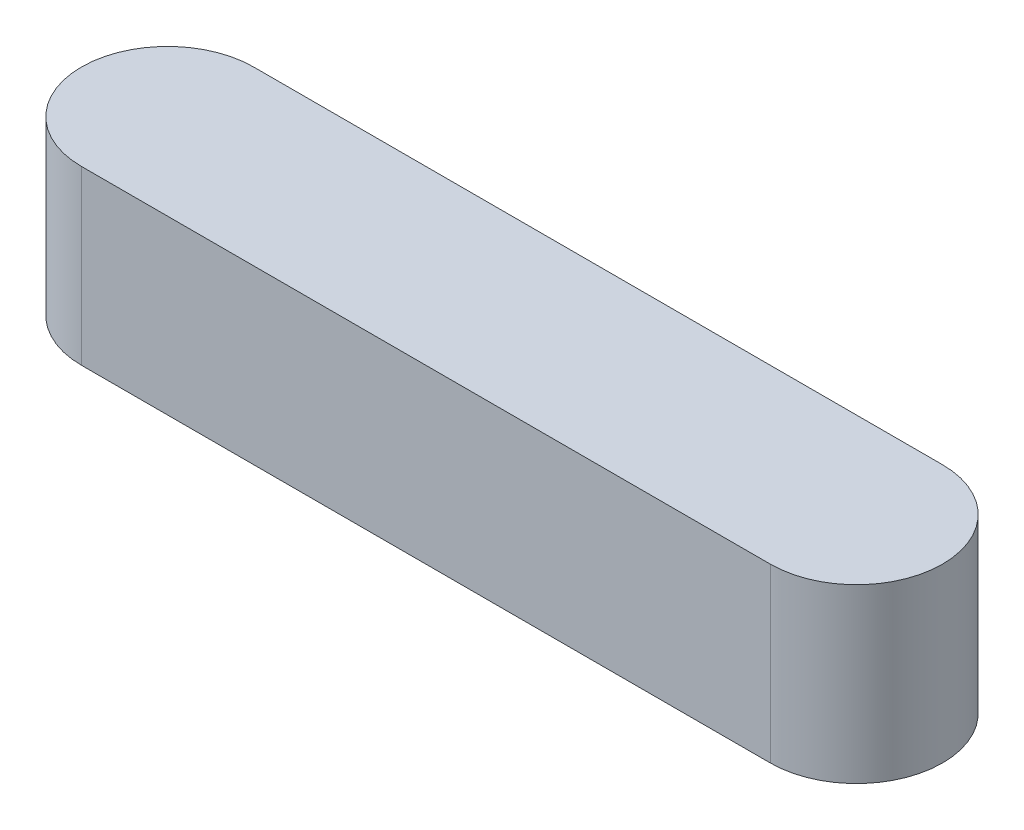
ISO-10303-21;
HEADER;
FILE_DESCRIPTION(('STEP AP214'),'2;1');
FILE_NAME('part.step','',(''),(''),'','','');
FILE_SCHEMA(('AUTOMOTIVE_DESIGN { 1 0 10303 214 1 1 1 1 }'));
ENDSEC;
DATA;
#1=APPLICATION_CONTEXT('core data for automotive mechanical design processes');
#2=APPLICATION_PROTOCOL_DEFINITION('international standard','automotive_design',2000,#1);
#3=PRODUCT_CONTEXT('',#1,'mechanical');
#4=PRODUCT('Part','Part','',(#3));
#5=PRODUCT_RELATED_PRODUCT_CATEGORY('part','',(#4));
#6=PRODUCT_DEFINITION_FORMATION('','',#4);
#7=PRODUCT_DEFINITION_CONTEXT('part definition',#1,'design');
#8=PRODUCT_DEFINITION('design','',#6,#7);
#9=PRODUCT_DEFINITION_SHAPE('','',#8);
#10=(LENGTH_UNIT() NAMED_UNIT(*) SI_UNIT(.MILLI.,.METRE.));
#11=(NAMED_UNIT(*) PLANE_ANGLE_UNIT() SI_UNIT($,.RADIAN.));
#12=(NAMED_UNIT(*) SI_UNIT($,.STERADIAN.) SOLID_ANGLE_UNIT());
#13=UNCERTAINTY_MEASURE_WITH_UNIT(LENGTH_MEASURE(1.E-05),#10,'distance_accuracy_value','');
#14=(GEOMETRIC_REPRESENTATION_CONTEXT(3) GLOBAL_UNCERTAINTY_ASSIGNED_CONTEXT((#13)) GLOBAL_UNIT_ASSIGNED_CONTEXT((#10,
#11,#12)) REPRESENTATION_CONTEXT('',''));
#15=CARTESIAN_POINT('',(0.,0.,0.));
#16=DIRECTION('',(0.,0.,1.));
#17=DIRECTION('',(1.,0.,0.));
#18=AXIS2_PLACEMENT_3D('',#15,#16,#17);
#19=CARTESIAN_POINT('',(-93.3804316139337,50.,0.));
#20=DIRECTION('',(0.,-1.,0.));
#21=DIRECTION('',(0.,0.,-1.));
#22=AXIS2_PLACEMENT_3D('',#19,#20,#21);
#23=CYLINDRICAL_SURFACE('',#22,25.);
#24=CARTESIAN_POINT('',(-93.3804316139337,0.,0.));
#25=DIRECTION('',(0.,1.,0.));
#26=DIRECTION('',(0.,0.,1.));
#27=AXIS2_PLACEMENT_3D('',#24,#25,#26);
#28=CIRCLE('',#27,25.);
#29=CARTESIAN_POINT('',(-93.3804316139337,0.,-25.));
#30=VERTEX_POINT('',#29);
#31=CARTESIAN_POINT('',(-93.3804316139337,0.,25.));
#32=VERTEX_POINT('',#31);
#33=EDGE_CURVE('E107',#30,#32,#28,.T.);
#34=ORIENTED_EDGE('',*,*,#33,.T.);
#35=DIRECTION('',(0.,-1.,0.));
#36=VECTOR('',#35,1.);
#37=CARTESIAN_POINT('',(-93.3804316139337,50.,25.));
#38=LINE('',#37,#36);
#39=CARTESIAN_POINT('',(-93.3804316139337,50.,25.));
#40=VERTEX_POINT('',#39);
#41=EDGE_CURVE('E11',#40,#32,#38,.T.);
#42=ORIENTED_EDGE('',*,*,#41,.F.);
#43=CARTESIAN_POINT('',(-93.3804316139337,50.,0.));
#44=DIRECTION('',(0.,1.,0.));
#45=DIRECTION('',(0.,0.,1.));
#46=AXIS2_PLACEMENT_3D('',#43,#44,#45);
#47=CIRCLE('',#46,25.);
#48=CARTESIAN_POINT('',(-93.3804316139337,50.,-25.));
#49=VERTEX_POINT('',#48);
#50=EDGE_CURVE('E91',#49,#40,#47,.T.);
#51=ORIENTED_EDGE('',*,*,#50,.F.);
#52=DIRECTION('',(0.,-1.,0.));
#53=VECTOR('',#52,1.);
#54=CARTESIAN_POINT('',(-93.3804316139337,50.,-25.));
#55=LINE('',#54,#53);
#56=EDGE_CURVE('E103',#49,#30,#55,.T.);
#57=ORIENTED_EDGE('',*,*,#56,.T.);
#58=EDGE_LOOP('',(#34,#42,#51,#57));
#59=FACE_BOUND('',#58,.T.);
#60=ADVANCED_FACE('F39',(#59),#23,.T.);
#61=CARTESIAN_POINT('',(-93.3804316139337,50.,25.));
#62=DIRECTION('',(0.,0.,-1.));
#63=DIRECTION('',(-1.,0.,0.));
#64=AXIS2_PLACEMENT_3D('',#61,#62,#63);
#65=PLANE('',#64);
#66=DIRECTION('',(1.,0.,0.));
#67=VECTOR('',#66,1.);
#68=CARTESIAN_POINT('',(-93.3804316139337,0.,25.));
#69=LINE('',#68,#67);
#70=CARTESIAN_POINT('',(106.619568386066,0.,25.));
#71=VERTEX_POINT('',#70);
#72=EDGE_CURVE('E96',#32,#71,#69,.T.);
#73=ORIENTED_EDGE('',*,*,#72,.T.);
#74=DIRECTION('',(0.,-1.,0.));
#75=VECTOR('',#74,1.);
#76=CARTESIAN_POINT('',(106.619568386066,50.,25.));
#77=LINE('',#76,#75);
#78=CARTESIAN_POINT('',(106.619568386066,50.,25.));
#79=VERTEX_POINT('',#78);
#80=EDGE_CURVE('E48',#79,#71,#77,.T.);
#81=ORIENTED_EDGE('',*,*,#80,.F.);
#82=DIRECTION('',(1.,0.,0.));
#83=VECTOR('',#82,1.);
#84=CARTESIAN_POINT('',(-93.3804316139337,50.,25.));
#85=LINE('',#84,#83);
#86=EDGE_CURVE('E86',#40,#79,#85,.T.);
#87=ORIENTED_EDGE('',*,*,#86,.F.);
#88=ORIENTED_EDGE('',*,*,#41,.T.);
#89=EDGE_LOOP('',(#73,#81,#87,#88));
#90=FACE_BOUND('',#89,.T.);
#91=ADVANCED_FACE('F95',(#90),#65,.F.);
#92=CARTESIAN_POINT('',(106.619568386066,50.,0.));
#93=DIRECTION('',(0.,-1.,0.));
#94=DIRECTION('',(0.,0.,-1.));
#95=AXIS2_PLACEMENT_3D('',#92,#93,#94);
#96=CYLINDRICAL_SURFACE('',#95,25.);
#97=CARTESIAN_POINT('',(106.619568386066,0.,0.));
#98=DIRECTION('',(0.,1.,0.));
#99=DIRECTION('',(0.,0.,1.));
#100=AXIS2_PLACEMENT_3D('',#97,#98,#99);
#101=CIRCLE('',#100,25.);
#102=CARTESIAN_POINT('',(106.619568386066,0.,-25.));
#103=VERTEX_POINT('',#102);
#104=EDGE_CURVE('E73',#71,#103,#101,.T.);
#105=ORIENTED_EDGE('',*,*,#104,.T.);
#106=DIRECTION('',(0.,-1.,0.));
#107=VECTOR('',#106,1.);
#108=CARTESIAN_POINT('',(106.619568386066,50.,-25.));
#109=LINE('',#108,#107);
#110=CARTESIAN_POINT('',(106.619568386066,50.,-25.));
#111=VERTEX_POINT('',#110);
#112=EDGE_CURVE('E98',#111,#103,#109,.T.);
#113=ORIENTED_EDGE('',*,*,#112,.F.);
#114=CARTESIAN_POINT('',(106.619568386066,50.,0.));
#115=DIRECTION('',(0.,1.,0.));
#116=DIRECTION('',(0.,0.,1.));
#117=AXIS2_PLACEMENT_3D('',#114,#115,#116);
#118=CIRCLE('',#117,25.);
#119=EDGE_CURVE('E89',#79,#111,#118,.T.);
#120=ORIENTED_EDGE('',*,*,#119,.F.);
#121=ORIENTED_EDGE('',*,*,#80,.T.);
#122=EDGE_LOOP('',(#105,#113,#120,#121));
#123=FACE_BOUND('',#122,.T.);
#124=ADVANCED_FACE('F99',(#123),#96,.T.);
#125=CARTESIAN_POINT('',(-93.3804316139337,50.,-25.));
#126=DIRECTION('',(0.,0.,1.));
#127=DIRECTION('',(1.,0.,0.));
#128=AXIS2_PLACEMENT_3D('',#125,#126,#127);
#129=PLANE('',#128);
#130=DIRECTION('',(-1.,0.,0.));
#131=VECTOR('',#130,1.);
#132=CARTESIAN_POINT('',(-93.3804316139337,0.,-25.));
#133=LINE('',#132,#131);
#134=EDGE_CURVE('E79',#103,#30,#133,.T.);
#135=ORIENTED_EDGE('',*,*,#134,.T.);
#136=ORIENTED_EDGE('',*,*,#56,.F.);
#137=DIRECTION('',(-1.,0.,0.));
#138=VECTOR('',#137,1.);
#139=CARTESIAN_POINT('',(-93.3804316139337,50.,-25.));
#140=LINE('',#139,#138);
#141=EDGE_CURVE('E56',#111,#49,#140,.T.);
#142=ORIENTED_EDGE('',*,*,#141,.F.);
#143=ORIENTED_EDGE('',*,*,#112,.T.);
#144=EDGE_LOOP('',(#135,#136,#142,#143));
#145=FACE_BOUND('',#144,.T.);
#146=ADVANCED_FACE('F120',(#145),#129,.F.);
#147=CARTESIAN_POINT('',(-93.3804316139337,50.,0.));
#148=DIRECTION('',(0.,1.,0.));
#149=DIRECTION('',(0.,0.,1.));
#150=AXIS2_PLACEMENT_3D('',#147,#148,#149);
#151=PLANE('',#150);
#152=ORIENTED_EDGE('',*,*,#50,.T.);
#153=ORIENTED_EDGE('',*,*,#86,.T.);
#154=ORIENTED_EDGE('',*,*,#119,.T.);
#155=ORIENTED_EDGE('',*,*,#141,.T.);
#156=EDGE_LOOP('',(#152,#153,#154,#155));
#157=FACE_BOUND('',#156,.T.);
#158=ADVANCED_FACE('F87',(#157),#151,.T.);
#159=CARTESIAN_POINT('',(-93.3804316139337,0.,0.));
#160=DIRECTION('',(0.,1.,0.));
#161=DIRECTION('',(0.,0.,1.));
#162=AXIS2_PLACEMENT_3D('',#159,#160,#161);
#163=PLANE('',#162);
#164=ORIENTED_EDGE('',*,*,#33,.F.);
#165=ORIENTED_EDGE('',*,*,#134,.F.);
#166=ORIENTED_EDGE('',*,*,#104,.F.);
#167=ORIENTED_EDGE('',*,*,#72,.F.);
#168=EDGE_LOOP('',(#164,#165,#166,#167));
#169=FACE_BOUND('',#168,.T.);
#170=ADVANCED_FACE('F123',(#169),#163,.F.);
#171=CLOSED_SHELL('',(#60,#91,#124,#146,#158,#170));
#172=MANIFOLD_SOLID_BREP('B2',#171);
#173=ADVANCED_BREP_SHAPE_REPRESENTATION('',(#18,#172),#14);
#174=SHAPE_DEFINITION_REPRESENTATION(#9,#173);
ENDSEC;
END-ISO-10303-21;
